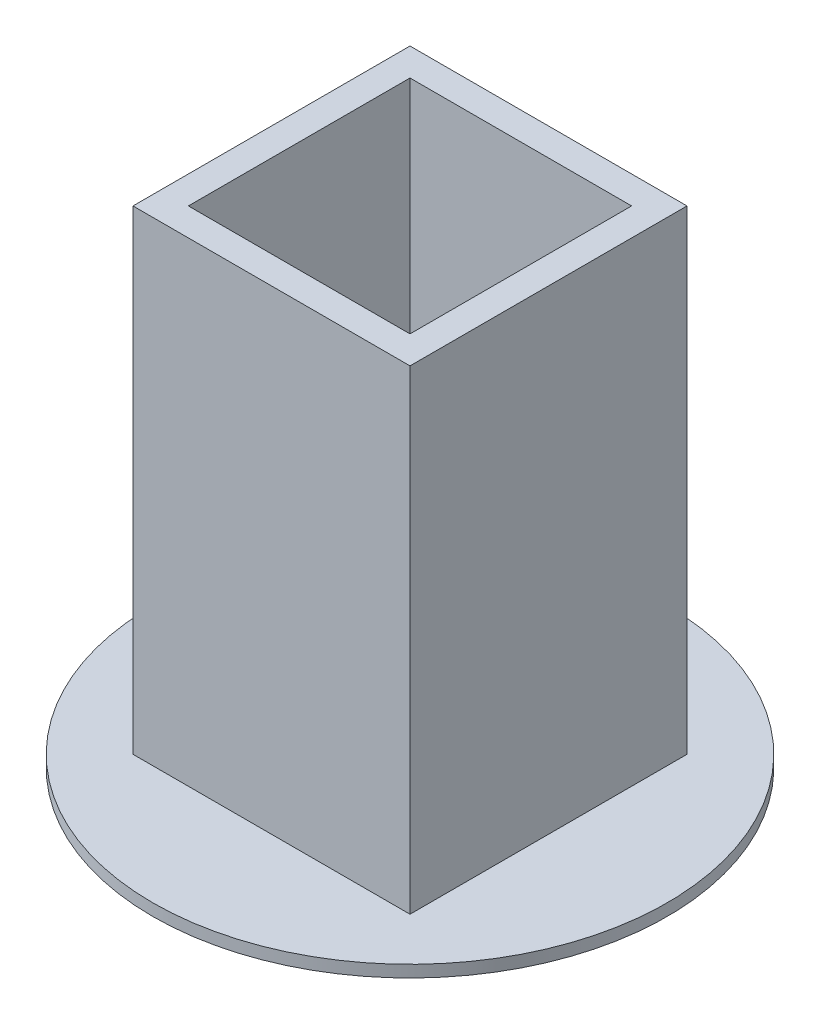
ISO-10303-21;
HEADER;
FILE_DESCRIPTION(('STEP AP214'),'2;1');
FILE_NAME('part.step','',(''),(''),'','','');
FILE_SCHEMA(('AUTOMOTIVE_DESIGN { 1 0 10303 214 1 1 1 1 }'));
ENDSEC;
DATA;
#1=APPLICATION_CONTEXT('core data for automotive mechanical design processes');
#2=APPLICATION_PROTOCOL_DEFINITION('international standard','automotive_design',2000,#1);
#3=PRODUCT_CONTEXT('',#1,'mechanical');
#4=PRODUCT('Part','Part','',(#3));
#5=PRODUCT_RELATED_PRODUCT_CATEGORY('part','',(#4));
#6=PRODUCT_DEFINITION_FORMATION('','',#4);
#7=PRODUCT_DEFINITION_CONTEXT('part definition',#1,'design');
#8=PRODUCT_DEFINITION('design','',#6,#7);
#9=PRODUCT_DEFINITION_SHAPE('','',#8);
#10=(LENGTH_UNIT() NAMED_UNIT(*) SI_UNIT(.MILLI.,.METRE.));
#11=(NAMED_UNIT(*) PLANE_ANGLE_UNIT() SI_UNIT($,.RADIAN.));
#12=(NAMED_UNIT(*) SI_UNIT($,.STERADIAN.) SOLID_ANGLE_UNIT());
#13=UNCERTAINTY_MEASURE_WITH_UNIT(LENGTH_MEASURE(1.E-05),#10,'distance_accuracy_value','');
#14=(GEOMETRIC_REPRESENTATION_CONTEXT(3) GLOBAL_UNCERTAINTY_ASSIGNED_CONTEXT((#13)) GLOBAL_UNIT_ASSIGNED_CONTEXT((#10,
#11,#12)) REPRESENTATION_CONTEXT('',''));
#15=CARTESIAN_POINT('',(0.,0.,0.));
#16=DIRECTION('',(0.,0.,1.));
#17=DIRECTION('',(1.,0.,0.));
#18=AXIS2_PLACEMENT_3D('',#15,#16,#17);
#19=CARTESIAN_POINT('',(0.,3.,0.));
#20=DIRECTION('',(0.,-1.,0.));
#21=DIRECTION('',(0.,0.,-1.));
#22=AXIS2_PLACEMENT_3D('',#19,#20,#21);
#23=CYLINDRICAL_SURFACE('',#22,65.);
#24=CARTESIAN_POINT('',(0.,3.,0.));
#25=DIRECTION('',(0.,1.,0.));
#26=DIRECTION('',(0.,0.,1.));
#27=AXIS2_PLACEMENT_3D('',#24,#25,#26);
#28=CIRCLE('',#27,65.);
#29=CARTESIAN_POINT('',(0.,3.,65.));
#30=VERTEX_POINT('',#29);
#31=EDGE_CURVE('E11',#30,#30,#28,.T.);
#32=ORIENTED_EDGE('',*,*,#31,.F.);
#33=EDGE_LOOP('',(#32));
#34=FACE_BOUND('',#33,.T.);
#35=CARTESIAN_POINT('',(0.,0.,0.));
#36=DIRECTION('',(0.,1.,0.));
#37=DIRECTION('',(0.,0.,1.));
#38=AXIS2_PLACEMENT_3D('',#35,#36,#37);
#39=CIRCLE('',#38,65.);
#40=CARTESIAN_POINT('',(0.,0.,65.));
#41=VERTEX_POINT('',#40);
#42=EDGE_CURVE('E44',#41,#41,#39,.T.);
#43=ORIENTED_EDGE('',*,*,#42,.T.);
#44=EDGE_LOOP('',(#43));
#45=FACE_BOUND('',#44,.T.);
#46=ADVANCED_FACE('F41',(#34,#45),#23,.T.);
#47=CARTESIAN_POINT('',(0.,3.,0.));
#48=DIRECTION('',(0.,1.,0.));
#49=DIRECTION('',(0.,0.,1.));
#50=AXIS2_PLACEMENT_3D('',#47,#48,#49);
#51=PLANE('',#50);
#52=DIRECTION('',(0.,0.,-1.));
#53=VECTOR('',#52,1.);
#54=CARTESIAN_POINT('',(34.9999999999999,3.,-35.));
#55=LINE('',#54,#53);
#56=CARTESIAN_POINT('',(35.0000000000001,3.,35.));
#57=VERTEX_POINT('',#56);
#58=CARTESIAN_POINT('',(34.9999999999999,3.,-35.));
#59=VERTEX_POINT('',#58);
#60=EDGE_CURVE('E63',#57,#59,#55,.T.);
#61=ORIENTED_EDGE('',*,*,#60,.F.);
#62=DIRECTION('',(1.,0.,0.));
#63=VECTOR('',#62,1.);
#64=CARTESIAN_POINT('',(-34.9999999999999,3.,35.));
#65=LINE('',#64,#63);
#66=CARTESIAN_POINT('',(-34.9999999999999,3.,35.));
#67=VERTEX_POINT('',#66);
#68=EDGE_CURVE('E147',#67,#57,#65,.T.);
#69=ORIENTED_EDGE('',*,*,#68,.F.);
#70=DIRECTION('',(0.,0.,1.));
#71=VECTOR('',#70,1.);
#72=CARTESIAN_POINT('',(-34.9999999999999,3.,35.));
#73=LINE('',#72,#71);
#74=CARTESIAN_POINT('',(-35.0000000000001,3.,-35.));
#75=VERTEX_POINT('',#74);
#76=EDGE_CURVE('E158',#75,#67,#73,.T.);
#77=ORIENTED_EDGE('',*,*,#76,.F.);
#78=DIRECTION('',(-1.,0.,0.));
#79=VECTOR('',#78,1.);
#80=CARTESIAN_POINT('',(-35.0000000000001,3.,-35.));
#81=LINE('',#80,#79);
#82=EDGE_CURVE('E155',#59,#75,#81,.T.);
#83=ORIENTED_EDGE('',*,*,#82,.F.);
#84=EDGE_LOOP('',(#61,#69,#77,#83));
#85=FACE_BOUND('',#84,.T.);
#86=ORIENTED_EDGE('',*,*,#31,.T.);
#87=EDGE_LOOP('',(#86));
#88=FACE_BOUND('',#87,.T.);
#89=ADVANCED_FACE('F181',(#85,#88),#51,.T.);
#90=CARTESIAN_POINT('',(0.,0.,0.));
#91=DIRECTION('',(0.,1.,0.));
#92=DIRECTION('',(0.,0.,1.));
#93=AXIS2_PLACEMENT_3D('',#90,#91,#92);
#94=PLANE('',#93);
#95=ORIENTED_EDGE('',*,*,#42,.F.);
#96=EDGE_LOOP('',(#95));
#97=FACE_BOUND('',#96,.T.);
#98=ADVANCED_FACE('F178',(#97),#94,.F.);
#99=CARTESIAN_POINT('',(34.9999999999999,123.,-35.));
#100=DIRECTION('',(-1.,0.,0.));
#101=DIRECTION('',(0.,0.,1.));
#102=AXIS2_PLACEMENT_3D('',#99,#100,#101);
#103=PLANE('',#102);
#104=ORIENTED_EDGE('',*,*,#60,.T.);
#105=DIRECTION('',(0.,-1.,0.));
#106=VECTOR('',#105,1.);
#107=CARTESIAN_POINT('',(34.9999999999999,123.,-35.));
#108=LINE('',#107,#106);
#109=CARTESIAN_POINT('',(34.9999999999999,123.,-35.));
#110=VERTEX_POINT('',#109);
#111=EDGE_CURVE('E170',#110,#59,#108,.T.);
#112=ORIENTED_EDGE('',*,*,#111,.F.);
#113=DIRECTION('',(0.,0.,-1.));
#114=VECTOR('',#113,1.);
#115=CARTESIAN_POINT('',(34.9999999999999,123.,-35.));
#116=LINE('',#115,#114);
#117=CARTESIAN_POINT('',(35.0000000000001,123.,35.));
#118=VERTEX_POINT('',#117);
#119=EDGE_CURVE('E143',#118,#110,#116,.T.);
#120=ORIENTED_EDGE('',*,*,#119,.F.);
#121=DIRECTION('',(0.,-1.,0.));
#122=VECTOR('',#121,1.);
#123=CARTESIAN_POINT('',(35.0000000000001,123.,35.));
#124=LINE('',#123,#122);
#125=EDGE_CURVE('E153',#118,#57,#124,.T.);
#126=ORIENTED_EDGE('',*,*,#125,.T.);
#127=EDGE_LOOP('',(#104,#112,#120,#126));
#128=FACE_BOUND('',#127,.T.);
#129=ADVANCED_FACE('F180',(#128),#103,.F.);
#130=CARTESIAN_POINT('',(-35.0000000000001,123.,-35.));
#131=DIRECTION('',(0.,0.,1.));
#132=DIRECTION('',(1.,0.,0.));
#133=AXIS2_PLACEMENT_3D('',#130,#131,#132);
#134=PLANE('',#133);
#135=ORIENTED_EDGE('',*,*,#82,.T.);
#136=DIRECTION('',(0.,-1.,0.));
#137=VECTOR('',#136,1.);
#138=CARTESIAN_POINT('',(-35.0000000000001,123.,-35.));
#139=LINE('',#138,#137);
#140=CARTESIAN_POINT('',(-35.0000000000001,123.,-35.));
#141=VERTEX_POINT('',#140);
#142=EDGE_CURVE('E167',#141,#75,#139,.T.);
#143=ORIENTED_EDGE('',*,*,#142,.F.);
#144=DIRECTION('',(-1.,0.,0.));
#145=VECTOR('',#144,1.);
#146=CARTESIAN_POINT('',(-35.0000000000001,123.,-35.));
#147=LINE('',#146,#145);
#148=EDGE_CURVE('E146',#110,#141,#147,.T.);
#149=ORIENTED_EDGE('',*,*,#148,.F.);
#150=ORIENTED_EDGE('',*,*,#111,.T.);
#151=EDGE_LOOP('',(#135,#143,#149,#150));
#152=FACE_BOUND('',#151,.T.);
#153=ADVANCED_FACE('F186',(#152),#134,.F.);
#154=CARTESIAN_POINT('',(-34.9999999999999,123.,35.));
#155=DIRECTION('',(1.,0.,0.));
#156=DIRECTION('',(0.,0.,-1.));
#157=AXIS2_PLACEMENT_3D('',#154,#155,#156);
#158=PLANE('',#157);
#159=ORIENTED_EDGE('',*,*,#76,.T.);
#160=DIRECTION('',(0.,-1.,0.));
#161=VECTOR('',#160,1.);
#162=CARTESIAN_POINT('',(-34.9999999999999,123.,35.));
#163=LINE('',#162,#161);
#164=CARTESIAN_POINT('',(-34.9999999999999,123.,35.));
#165=VERTEX_POINT('',#164);
#166=EDGE_CURVE('E164',#165,#67,#163,.T.);
#167=ORIENTED_EDGE('',*,*,#166,.F.);
#168=DIRECTION('',(0.,0.,1.));
#169=VECTOR('',#168,1.);
#170=CARTESIAN_POINT('',(-34.9999999999999,123.,35.));
#171=LINE('',#170,#169);
#172=EDGE_CURVE('E149',#141,#165,#171,.T.);
#173=ORIENTED_EDGE('',*,*,#172,.F.);
#174=ORIENTED_EDGE('',*,*,#142,.T.);
#175=EDGE_LOOP('',(#159,#167,#173,#174));
#176=FACE_BOUND('',#175,.T.);
#177=ADVANCED_FACE('F219',(#176),#158,.F.);
#178=CARTESIAN_POINT('',(-34.9999999999999,123.,35.));
#179=DIRECTION('',(0.,0.,-1.));
#180=DIRECTION('',(-1.,0.,0.));
#181=AXIS2_PLACEMENT_3D('',#178,#179,#180);
#182=PLANE('',#181);
#183=ORIENTED_EDGE('',*,*,#68,.T.);
#184=ORIENTED_EDGE('',*,*,#125,.F.);
#185=DIRECTION('',(1.,0.,0.));
#186=VECTOR('',#185,1.);
#187=CARTESIAN_POINT('',(-34.9999999999999,123.,35.));
#188=LINE('',#187,#186);
#189=EDGE_CURVE('E151',#165,#118,#188,.T.);
#190=ORIENTED_EDGE('',*,*,#189,.F.);
#191=ORIENTED_EDGE('',*,*,#166,.T.);
#192=EDGE_LOOP('',(#183,#184,#190,#191));
#193=FACE_BOUND('',#192,.T.);
#194=ADVANCED_FACE('F229',(#193),#182,.F.);
#195=CARTESIAN_POINT('',(0.,123.,0.));
#196=DIRECTION('',(0.,1.,0.));
#197=DIRECTION('',(0.,0.,1.));
#198=AXIS2_PLACEMENT_3D('',#195,#196,#197);
#199=PLANE('',#198);
#200=DIRECTION('',(0.,0.,-1.));
#201=VECTOR('',#200,1.);
#202=CARTESIAN_POINT('',(27.9999999999999,123.,-35.));
#203=LINE('',#202,#201);
#204=CARTESIAN_POINT('',(28.0000000000001,123.,28.));
#205=VERTEX_POINT('',#204);
#206=CARTESIAN_POINT('',(27.9999999999999,123.,-28.));
#207=VERTEX_POINT('',#206);
#208=EDGE_CURVE('E106',#205,#207,#203,.T.);
#209=ORIENTED_EDGE('',*,*,#208,.F.);
#210=DIRECTION('',(1.,0.,0.));
#211=VECTOR('',#210,1.);
#212=CARTESIAN_POINT('',(-34.9999999999999,123.,28.));
#213=LINE('',#212,#211);
#214=CARTESIAN_POINT('',(-27.9999999999999,123.,28.));
#215=VERTEX_POINT('',#214);
#216=EDGE_CURVE('E132',#215,#205,#213,.T.);
#217=ORIENTED_EDGE('',*,*,#216,.F.);
#218=DIRECTION('',(0.,0.,1.));
#219=VECTOR('',#218,1.);
#220=CARTESIAN_POINT('',(-27.9999999999999,123.,35.));
#221=LINE('',#220,#219);
#222=CARTESIAN_POINT('',(-28.0000000000001,123.,-28.));
#223=VERTEX_POINT('',#222);
#224=EDGE_CURVE('E130',#223,#215,#221,.T.);
#225=ORIENTED_EDGE('',*,*,#224,.F.);
#226=DIRECTION('',(-1.,0.,0.));
#227=VECTOR('',#226,1.);
#228=CARTESIAN_POINT('',(-35.0000000000001,123.,-28.));
#229=LINE('',#228,#227);
#230=EDGE_CURVE('E115',#207,#223,#229,.T.);
#231=ORIENTED_EDGE('',*,*,#230,.F.);
#232=EDGE_LOOP('',(#209,#217,#225,#231));
#233=FACE_BOUND('',#232,.T.);
#234=ORIENTED_EDGE('',*,*,#119,.T.);
#235=ORIENTED_EDGE('',*,*,#148,.T.);
#236=ORIENTED_EDGE('',*,*,#172,.T.);
#237=ORIENTED_EDGE('',*,*,#189,.T.);
#238=EDGE_LOOP('',(#234,#235,#236,#237));
#239=FACE_BOUND('',#238,.T.);
#240=ADVANCED_FACE('F128',(#233,#239),#199,.T.);
#241=CARTESIAN_POINT('',(0.,7.,0.));
#242=DIRECTION('',(0.,1.,0.));
#243=DIRECTION('',(0.,0.,1.));
#244=AXIS2_PLACEMENT_3D('',#241,#242,#243);
#245=PLANE('',#244);
#246=DIRECTION('',(0.,0.,-1.));
#247=VECTOR('',#246,1.);
#248=CARTESIAN_POINT('',(-28.,7.,0.));
#249=LINE('',#248,#247);
#250=CARTESIAN_POINT('',(-27.9999999999999,7.,28.));
#251=VERTEX_POINT('',#250);
#252=CARTESIAN_POINT('',(-28.0000000000001,7.,-28.));
#253=VERTEX_POINT('',#252);
#254=EDGE_CURVE('E140',#251,#253,#249,.T.);
#255=ORIENTED_EDGE('',*,*,#254,.F.);
#256=DIRECTION('',(-1.,0.,0.));
#257=VECTOR('',#256,1.);
#258=CARTESIAN_POINT('',(0.,7.,28.));
#259=LINE('',#258,#257);
#260=CARTESIAN_POINT('',(28.0000000000001,7.,28.));
#261=VERTEX_POINT('',#260);
#262=EDGE_CURVE('E138',#261,#251,#259,.T.);
#263=ORIENTED_EDGE('',*,*,#262,.F.);
#264=DIRECTION('',(0.,0.,1.));
#265=VECTOR('',#264,1.);
#266=CARTESIAN_POINT('',(28.,7.,0.));
#267=LINE('',#266,#265);
#268=CARTESIAN_POINT('',(27.9999999999999,7.,-28.));
#269=VERTEX_POINT('',#268);
#270=EDGE_CURVE('E124',#269,#261,#267,.T.);
#271=ORIENTED_EDGE('',*,*,#270,.F.);
#272=DIRECTION('',(1.,0.,0.));
#273=VECTOR('',#272,1.);
#274=CARTESIAN_POINT('',(0.,7.,-28.));
#275=LINE('',#274,#273);
#276=EDGE_CURVE('E123',#253,#269,#275,.T.);
#277=ORIENTED_EDGE('',*,*,#276,.F.);
#278=EDGE_LOOP('',(#255,#263,#271,#277));
#279=FACE_BOUND('',#278,.T.);
#280=ADVANCED_FACE('F250',(#279),#245,.T.);
#281=CARTESIAN_POINT('',(27.9999999999999,123.,-35.));
#282=DIRECTION('',(-1.,0.,0.));
#283=DIRECTION('',(0.,0.,1.));
#284=AXIS2_PLACEMENT_3D('',#281,#282,#283);
#285=PLANE('',#284);
#286=ORIENTED_EDGE('',*,*,#270,.T.);
#287=DIRECTION('',(0.,-1.,0.));
#288=VECTOR('',#287,1.);
#289=CARTESIAN_POINT('',(28.0000000000001,123.,28.));
#290=LINE('',#289,#288);
#291=EDGE_CURVE('E111',#205,#261,#290,.T.);
#292=ORIENTED_EDGE('',*,*,#291,.F.);
#293=ORIENTED_EDGE('',*,*,#208,.T.);
#294=DIRECTION('',(0.,-1.,0.));
#295=VECTOR('',#294,1.);
#296=CARTESIAN_POINT('',(27.9999999999999,123.,-28.));
#297=LINE('',#296,#295);
#298=EDGE_CURVE('E109',#207,#269,#297,.T.);
#299=ORIENTED_EDGE('',*,*,#298,.T.);
#300=EDGE_LOOP('',(#286,#292,#293,#299));
#301=FACE_BOUND('',#300,.T.);
#302=ADVANCED_FACE('F108',(#301),#285,.T.);
#303=CARTESIAN_POINT('',(-35.0000000000001,123.,-28.));
#304=DIRECTION('',(0.,0.,1.));
#305=DIRECTION('',(1.,0.,0.));
#306=AXIS2_PLACEMENT_3D('',#303,#304,#305);
#307=PLANE('',#306);
#308=ORIENTED_EDGE('',*,*,#276,.T.);
#309=ORIENTED_EDGE('',*,*,#298,.F.);
#310=ORIENTED_EDGE('',*,*,#230,.T.);
#311=DIRECTION('',(0.,-1.,0.));
#312=VECTOR('',#311,1.);
#313=CARTESIAN_POINT('',(-28.0000000000001,123.,-28.));
#314=LINE('',#313,#312);
#315=EDGE_CURVE('E125',#223,#253,#314,.T.);
#316=ORIENTED_EDGE('',*,*,#315,.T.);
#317=EDGE_LOOP('',(#308,#309,#310,#316));
#318=FACE_BOUND('',#317,.T.);
#319=ADVANCED_FACE('F119',(#318),#307,.T.);
#320=CARTESIAN_POINT('',(-27.9999999999999,123.,35.));
#321=DIRECTION('',(1.,0.,0.));
#322=DIRECTION('',(0.,0.,-1.));
#323=AXIS2_PLACEMENT_3D('',#320,#321,#322);
#324=PLANE('',#323);
#325=ORIENTED_EDGE('',*,*,#254,.T.);
#326=ORIENTED_EDGE('',*,*,#315,.F.);
#327=ORIENTED_EDGE('',*,*,#224,.T.);
#328=DIRECTION('',(0.,-1.,0.));
#329=VECTOR('',#328,1.);
#330=CARTESIAN_POINT('',(-27.9999999999999,123.,28.));
#331=LINE('',#330,#329);
#332=EDGE_CURVE('E55',#215,#251,#331,.T.);
#333=ORIENTED_EDGE('',*,*,#332,.T.);
#334=EDGE_LOOP('',(#325,#326,#327,#333));
#335=FACE_BOUND('',#334,.T.);
#336=ADVANCED_FACE('F279',(#335),#324,.T.);
#337=CARTESIAN_POINT('',(-34.9999999999999,123.,28.));
#338=DIRECTION('',(0.,0.,-1.));
#339=DIRECTION('',(-1.,0.,0.));
#340=AXIS2_PLACEMENT_3D('',#337,#338,#339);
#341=PLANE('',#340);
#342=ORIENTED_EDGE('',*,*,#262,.T.);
#343=ORIENTED_EDGE('',*,*,#332,.F.);
#344=ORIENTED_EDGE('',*,*,#216,.T.);
#345=ORIENTED_EDGE('',*,*,#291,.T.);
#346=EDGE_LOOP('',(#342,#343,#344,#345));
#347=FACE_BOUND('',#346,.T.);
#348=ADVANCED_FACE('F289',(#347),#341,.T.);
#349=CLOSED_SHELL('',(#46,#89,#98,#129,#153,#177,#194,#240,#280,#302,#319,#336,#348));
#350=MANIFOLD_SOLID_BREP('B2',#349);
#351=ADVANCED_BREP_SHAPE_REPRESENTATION('',(#18,#350),#14);
#352=SHAPE_DEFINITION_REPRESENTATION(#9,#351);
ENDSEC;
END-ISO-10303-21;
